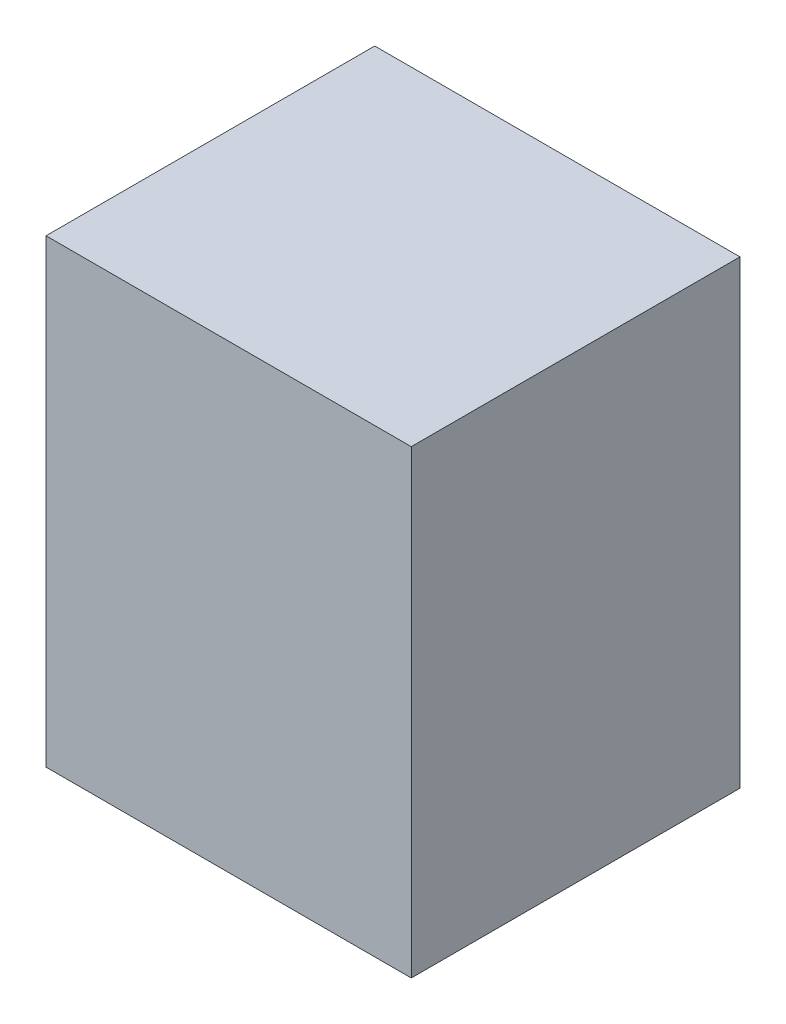
ISO-10303-21;
HEADER;
FILE_DESCRIPTION(('STEP AP214'),'2;1');
FILE_NAME('part.step','',(''),(''),'','','');
FILE_SCHEMA(('AUTOMOTIVE_DESIGN { 1 0 10303 214 1 1 1 1 }'));
ENDSEC;
DATA;
#1=APPLICATION_CONTEXT('core data for automotive mechanical design processes');
#2=APPLICATION_PROTOCOL_DEFINITION('international standard','automotive_design',2000,#1);
#3=PRODUCT_CONTEXT('',#1,'mechanical');
#4=PRODUCT('Part','Part','',(#3));
#5=PRODUCT_RELATED_PRODUCT_CATEGORY('part','',(#4));
#6=PRODUCT_DEFINITION_FORMATION('','',#4);
#7=PRODUCT_DEFINITION_CONTEXT('part definition',#1,'design');
#8=PRODUCT_DEFINITION('design','',#6,#7);
#9=PRODUCT_DEFINITION_SHAPE('','',#8);
#10=(LENGTH_UNIT() NAMED_UNIT(*) SI_UNIT(.MILLI.,.METRE.));
#11=(NAMED_UNIT(*) PLANE_ANGLE_UNIT() SI_UNIT($,.RADIAN.));
#12=(NAMED_UNIT(*) SI_UNIT($,.STERADIAN.) SOLID_ANGLE_UNIT());
#13=UNCERTAINTY_MEASURE_WITH_UNIT(LENGTH_MEASURE(1.E-05),#10,'distance_accuracy_value','');
#14=(GEOMETRIC_REPRESENTATION_CONTEXT(3) GLOBAL_UNCERTAINTY_ASSIGNED_CONTEXT((#13)) GLOBAL_UNIT_ASSIGNED_CONTEXT((#10,
#11,#12)) REPRESENTATION_CONTEXT('',''));
#15=CARTESIAN_POINT('',(0.,0.,0.));
#16=DIRECTION('',(0.,0.,1.));
#17=DIRECTION('',(1.,0.,0.));
#18=AXIS2_PLACEMENT_3D('',#15,#16,#17);
#19=CARTESIAN_POINT('',(0.,0.,9.));
#20=DIRECTION('',(1.,0.,0.));
#21=DIRECTION('',(0.,0.,-1.));
#22=AXIS2_PLACEMENT_3D('',#19,#20,#21);
#23=PLANE('',#22);
#24=DIRECTION('',(0.,-1.,0.));
#25=VECTOR('',#24,1.);
#26=CARTESIAN_POINT('',(0.,0.,0.));
#27=LINE('',#26,#25);
#28=CARTESIAN_POINT('',(0.,12.6,0.));
#29=VERTEX_POINT('',#28);
#30=CARTESIAN_POINT('',(0.,0.,0.));
#31=VERTEX_POINT('',#30);
#32=EDGE_CURVE('E96',#29,#31,#27,.T.);
#33=ORIENTED_EDGE('',*,*,#32,.T.);
#34=DIRECTION('',(0.,0.,-1.));
#35=VECTOR('',#34,1.);
#36=CARTESIAN_POINT('',(0.,0.,9.));
#37=LINE('',#36,#35);
#38=CARTESIAN_POINT('',(0.,0.,9.));
#39=VERTEX_POINT('',#38);
#40=EDGE_CURVE('E11',#39,#31,#37,.T.);
#41=ORIENTED_EDGE('',*,*,#40,.F.);
#42=DIRECTION('',(0.,-1.,0.));
#43=VECTOR('',#42,1.);
#44=CARTESIAN_POINT('',(0.,0.,9.));
#45=LINE('',#44,#43);
#46=CARTESIAN_POINT('',(0.,12.6,9.));
#47=VERTEX_POINT('',#46);
#48=EDGE_CURVE('E84',#47,#39,#45,.T.);
#49=ORIENTED_EDGE('',*,*,#48,.F.);
#50=DIRECTION('',(0.,0.,-1.));
#51=VECTOR('',#50,1.);
#52=CARTESIAN_POINT('',(0.,12.6,9.));
#53=LINE('',#52,#51);
#54=EDGE_CURVE('E92',#47,#29,#53,.T.);
#55=ORIENTED_EDGE('',*,*,#54,.T.);
#56=EDGE_LOOP('',(#33,#41,#49,#55));
#57=FACE_BOUND('',#56,.T.);
#58=ADVANCED_FACE('F33',(#57),#23,.F.);
#59=CARTESIAN_POINT('',(0.,0.,9.));
#60=DIRECTION('',(0.,1.,0.));
#61=DIRECTION('',(0.,0.,1.));
#62=AXIS2_PLACEMENT_3D('',#59,#60,#61);
#63=PLANE('',#62);
#64=DIRECTION('',(1.,0.,0.));
#65=VECTOR('',#64,1.);
#66=CARTESIAN_POINT('',(0.,0.,0.));
#67=LINE('',#66,#65);
#68=CARTESIAN_POINT('',(10.,0.,0.));
#69=VERTEX_POINT('',#68);
#70=EDGE_CURVE('E88',#31,#69,#67,.T.);
#71=ORIENTED_EDGE('',*,*,#70,.T.);
#72=DIRECTION('',(0.,0.,-1.));
#73=VECTOR('',#72,1.);
#74=CARTESIAN_POINT('',(10.,0.,9.));
#75=LINE('',#74,#73);
#76=CARTESIAN_POINT('',(10.,0.,9.));
#77=VERTEX_POINT('',#76);
#78=EDGE_CURVE('E41',#77,#69,#75,.T.);
#79=ORIENTED_EDGE('',*,*,#78,.F.);
#80=DIRECTION('',(1.,0.,0.));
#81=VECTOR('',#80,1.);
#82=CARTESIAN_POINT('',(0.,0.,9.));
#83=LINE('',#82,#81);
#84=EDGE_CURVE('E79',#39,#77,#83,.T.);
#85=ORIENTED_EDGE('',*,*,#84,.F.);
#86=ORIENTED_EDGE('',*,*,#40,.T.);
#87=EDGE_LOOP('',(#71,#79,#85,#86));
#88=FACE_BOUND('',#87,.T.);
#89=ADVANCED_FACE('F87',(#88),#63,.F.);
#90=CARTESIAN_POINT('',(10.,0.,9.));
#91=DIRECTION('',(-1.,0.,0.));
#92=DIRECTION('',(0.,-1.,0.));
#93=AXIS2_PLACEMENT_3D('',#90,#91,#92);
#94=PLANE('',#93);
#95=DIRECTION('',(0.,1.,0.));
#96=VECTOR('',#95,1.);
#97=CARTESIAN_POINT('',(10.,0.,0.));
#98=LINE('',#97,#96);
#99=CARTESIAN_POINT('',(10.,12.6,0.));
#100=VERTEX_POINT('',#99);
#101=EDGE_CURVE('E66',#69,#100,#98,.T.);
#102=ORIENTED_EDGE('',*,*,#101,.T.);
#103=DIRECTION('',(0.,0.,-1.));
#104=VECTOR('',#103,1.);
#105=CARTESIAN_POINT('',(10.,12.6,9.));
#106=LINE('',#105,#104);
#107=CARTESIAN_POINT('',(10.,12.6,9.));
#108=VERTEX_POINT('',#107);
#109=EDGE_CURVE('E89',#108,#100,#106,.T.);
#110=ORIENTED_EDGE('',*,*,#109,.F.);
#111=DIRECTION('',(0.,1.,0.));
#112=VECTOR('',#111,1.);
#113=CARTESIAN_POINT('',(10.,0.,9.));
#114=LINE('',#113,#112);
#115=EDGE_CURVE('E82',#77,#108,#114,.T.);
#116=ORIENTED_EDGE('',*,*,#115,.F.);
#117=ORIENTED_EDGE('',*,*,#78,.T.);
#118=EDGE_LOOP('',(#102,#110,#116,#117));
#119=FACE_BOUND('',#118,.T.);
#120=ADVANCED_FACE('F90',(#119),#94,.F.);
#121=CARTESIAN_POINT('',(0.,12.6,9.));
#122=DIRECTION('',(0.,-1.,0.));
#123=DIRECTION('',(0.,0.,-1.));
#124=AXIS2_PLACEMENT_3D('',#121,#122,#123);
#125=PLANE('',#124);
#126=DIRECTION('',(-1.,0.,0.));
#127=VECTOR('',#126,1.);
#128=CARTESIAN_POINT('',(0.,12.6,0.));
#129=LINE('',#128,#127);
#130=EDGE_CURVE('E72',#100,#29,#129,.T.);
#131=ORIENTED_EDGE('',*,*,#130,.T.);
#132=ORIENTED_EDGE('',*,*,#54,.F.);
#133=DIRECTION('',(-1.,0.,0.));
#134=VECTOR('',#133,1.);
#135=CARTESIAN_POINT('',(0.,12.6,9.));
#136=LINE('',#135,#134);
#137=EDGE_CURVE('E49',#108,#47,#136,.T.);
#138=ORIENTED_EDGE('',*,*,#137,.F.);
#139=ORIENTED_EDGE('',*,*,#109,.T.);
#140=EDGE_LOOP('',(#131,#132,#138,#139));
#141=FACE_BOUND('',#140,.T.);
#142=ADVANCED_FACE('F103',(#141),#125,.F.);
#143=CARTESIAN_POINT('',(0.,0.,9.));
#144=DIRECTION('',(0.,0.,-1.));
#145=DIRECTION('',(-1.,0.,0.));
#146=AXIS2_PLACEMENT_3D('',#143,#144,#145);
#147=PLANE('',#146);
#148=ORIENTED_EDGE('',*,*,#48,.T.);
#149=ORIENTED_EDGE('',*,*,#84,.T.);
#150=ORIENTED_EDGE('',*,*,#115,.T.);
#151=ORIENTED_EDGE('',*,*,#137,.T.);
#152=EDGE_LOOP('',(#148,#149,#150,#151));
#153=FACE_BOUND('',#152,.T.);
#154=ADVANCED_FACE('F80',(#153),#147,.F.);
#155=CARTESIAN_POINT('',(0.,0.,0.));
#156=DIRECTION('',(0.,0.,-1.));
#157=DIRECTION('',(-1.,0.,0.));
#158=AXIS2_PLACEMENT_3D('',#155,#156,#157);
#159=PLANE('',#158);
#160=ORIENTED_EDGE('',*,*,#32,.F.);
#161=ORIENTED_EDGE('',*,*,#130,.F.);
#162=ORIENTED_EDGE('',*,*,#101,.F.);
#163=ORIENTED_EDGE('',*,*,#70,.F.);
#164=EDGE_LOOP('',(#160,#161,#162,#163));
#165=FACE_BOUND('',#164,.T.);
#166=ADVANCED_FACE('F106',(#165),#159,.T.);
#167=CLOSED_SHELL('',(#58,#89,#120,#142,#154,#166));
#168=MANIFOLD_SOLID_BREP('B2',#167);
#169=ADVANCED_BREP_SHAPE_REPRESENTATION('',(#18,#168),#14);
#170=SHAPE_DEFINITION_REPRESENTATION(#9,#169);
ENDSEC;
END-ISO-10303-21;
